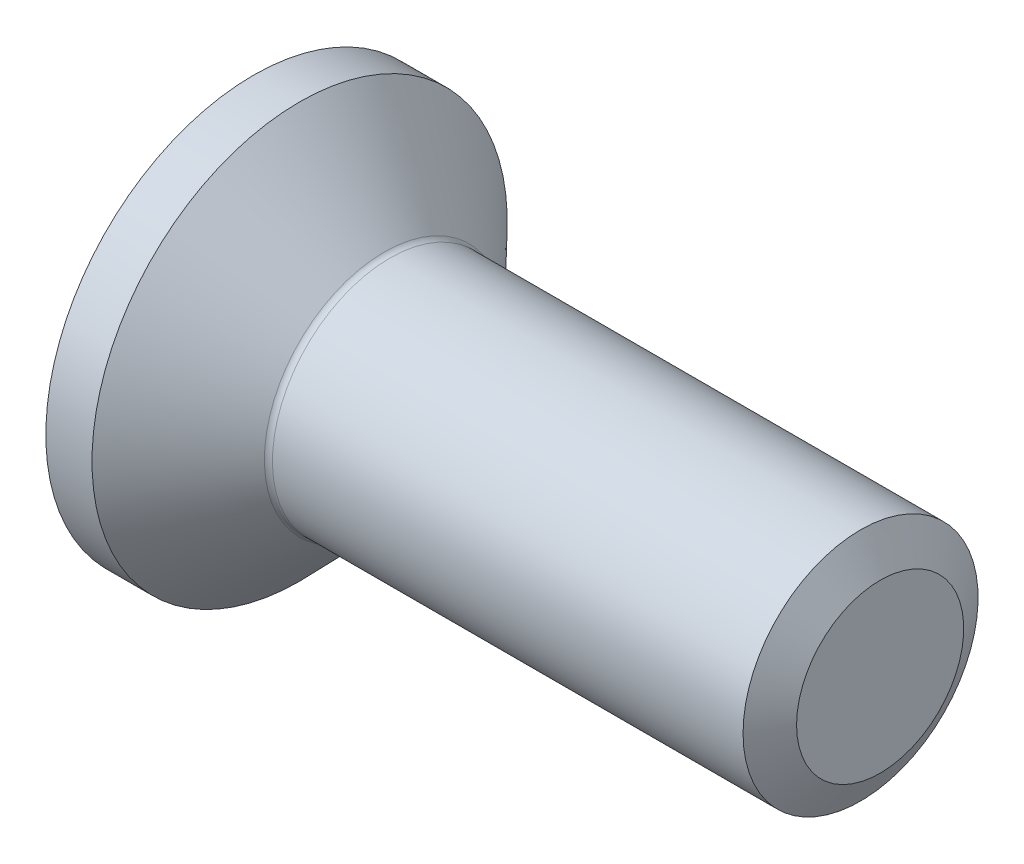
ISO-10303-21;
HEADER;
FILE_DESCRIPTION(('STEP AP214'),'2;1');
FILE_NAME('part.step','',(''),(''),'','','');
FILE_SCHEMA(('AUTOMOTIVE_DESIGN { 1 0 10303 214 1 1 1 1 }'));
ENDSEC;
DATA;
#1=APPLICATION_CONTEXT('core data for automotive mechanical design processes');
#2=APPLICATION_PROTOCOL_DEFINITION('international standard','automotive_design',2000,#1);
#3=PRODUCT_CONTEXT('',#1,'mechanical');
#4=PRODUCT('Part','Part','',(#3));
#5=PRODUCT_RELATED_PRODUCT_CATEGORY('part','',(#4));
#6=PRODUCT_DEFINITION_FORMATION('','',#4);
#7=PRODUCT_DEFINITION_CONTEXT('part definition',#1,'design');
#8=PRODUCT_DEFINITION('design','',#6,#7);
#9=PRODUCT_DEFINITION_SHAPE('','',#8);
#10=(LENGTH_UNIT() NAMED_UNIT(*) SI_UNIT(.MILLI.,.METRE.));
#11=(NAMED_UNIT(*) PLANE_ANGLE_UNIT() SI_UNIT($,.RADIAN.));
#12=(NAMED_UNIT(*) SI_UNIT($,.STERADIAN.) SOLID_ANGLE_UNIT());
#13=UNCERTAINTY_MEASURE_WITH_UNIT(LENGTH_MEASURE(1.E-05),#10,'distance_accuracy_value','');
#14=(GEOMETRIC_REPRESENTATION_CONTEXT(3) GLOBAL_UNCERTAINTY_ASSIGNED_CONTEXT((#13)) GLOBAL_UNIT_ASSIGNED_CONTEXT((#10,
#11,#12)) REPRESENTATION_CONTEXT('',''));
#15=CARTESIAN_POINT('',(0.,0.,0.));
#16=DIRECTION('',(0.,0.,1.));
#17=DIRECTION('',(1.,0.,0.));
#18=AXIS2_PLACEMENT_3D('',#15,#16,#17);
#19=CARTESIAN_POINT('',(0.,0.,0.));
#20=DIRECTION('',(1.,0.,0.));
#21=DIRECTION('',(0.,1.,0.));
#22=AXIS2_PLACEMENT_3D('',#19,#20,#21);
#23=CYLINDRICAL_SURFACE('',#22,1.5);
#24=CARTESIAN_POINT('',(-6.25755251837904,0.,0.));
#25=DIRECTION('',(1.,0.,0.));
#26=DIRECTION('',(0.,1.,0.));
#27=AXIS2_PLACEMENT_3D('',#24,#25,#26);
#28=CIRCLE('',#27,1.5);
#29=CARTESIAN_POINT('',(-6.25755251837904,1.5,0.));
#30=VERTEX_POINT('',#29);
#31=EDGE_CURVE('E131',#30,#30,#28,.T.);
#32=ORIENTED_EDGE('',*,*,#31,.T.);
#33=EDGE_LOOP('',(#32));
#34=FACE_BOUND('',#33,.T.);
#35=CARTESIAN_POINT('',(-0.25,0.,0.));
#36=DIRECTION('',(-1.,0.,0.));
#37=DIRECTION('',(0.,0.,1.));
#38=AXIS2_PLACEMENT_3D('',#35,#36,#37);
#39=CIRCLE('',#38,1.5);
#40=CARTESIAN_POINT('',(-0.25,0.,1.5));
#41=VERTEX_POINT('',#40);
#42=EDGE_CURVE('E319',#41,#41,#39,.T.);
#43=ORIENTED_EDGE('',*,*,#42,.T.);
#44=EDGE_LOOP('',(#43));
#45=FACE_BOUND('',#44,.T.);
#46=ADVANCED_FACE('F44',(#34,#45),#23,.T.);
#47=CARTESIAN_POINT('',(-8.,2.65,0.));
#48=DIRECTION('',(-1.,0.,0.));
#49=DIRECTION('',(0.,-1.,0.));
#50=AXIS2_PLACEMENT_3D('',#47,#48,#49);
#51=PLANE('',#50);
#52=CARTESIAN_POINT('',(-8.,0.,0.));
#53=DIRECTION('',(1.,0.,0.));
#54=DIRECTION('',(0.,1.,0.));
#55=AXIS2_PLACEMENT_3D('',#52,#53,#54);
#56=CIRCLE('',#55,2.65);
#57=CARTESIAN_POINT('',(-8.,2.65,0.));
#58=VERTEX_POINT('',#57);
#59=EDGE_CURVE('E222',#58,#58,#56,.T.);
#60=ORIENTED_EDGE('',*,*,#59,.F.);
#61=EDGE_LOOP('',(#60));
#62=FACE_BOUND('',#61,.T.);
#63=CARTESIAN_POINT('',(-8.,0.,0.));
#64=DIRECTION('',(-1.,0.,0.));
#65=DIRECTION('',(0.,-1.,0.));
#66=AXIS2_PLACEMENT_3D('',#63,#64,#65);
#67=CIRCLE('',#66,1.15470053837925);
#68=CARTESIAN_POINT('',(-8.,-0.577350269189627,1.));
#69=VERTEX_POINT('',#68);
#70=CARTESIAN_POINT('',(-8.,-1.15470053837925,0.));
#71=VERTEX_POINT('',#70);
#72=EDGE_CURVE('E48',#69,#71,#67,.F.);
#73=ORIENTED_EDGE('',*,*,#72,.T.);
#74=CARTESIAN_POINT('',(-8.,-0.577350269189627,-1.));
#75=VERTEX_POINT('',#74);
#76=EDGE_CURVE('E11',#71,#75,#67,.F.);
#77=ORIENTED_EDGE('',*,*,#76,.T.);
#78=CARTESIAN_POINT('',(-8.,0.577350269189627,-0.999999999999999));
#79=VERTEX_POINT('',#78);
#80=EDGE_CURVE('E53',#75,#79,#67,.F.);
#81=ORIENTED_EDGE('',*,*,#80,.T.);
#82=CARTESIAN_POINT('',(-8.,1.15470053837925,0.));
#83=VERTEX_POINT('',#82);
#84=EDGE_CURVE('E118',#79,#83,#67,.F.);
#85=ORIENTED_EDGE('',*,*,#84,.T.);
#86=CARTESIAN_POINT('',(-8.,0.,0.));
#87=DIRECTION('',(-1.,0.,0.));
#88=DIRECTION('',(0.,0.,1.));
#89=AXIS2_PLACEMENT_3D('',#86,#87,#88);
#90=CIRCLE('',#89,1.15470053837925);
#91=CARTESIAN_POINT('',(-8.,0.577350269189629,0.999999999999999));
#92=VERTEX_POINT('',#91);
#93=EDGE_CURVE('E103',#92,#83,#90,.T.);
#94=ORIENTED_EDGE('',*,*,#93,.F.);
#95=EDGE_CURVE('E112',#92,#69,#67,.F.);
#96=ORIENTED_EDGE('',*,*,#95,.T.);
#97=EDGE_LOOP('',(#73,#77,#81,#85,#94,#96));
#98=FACE_BOUND('',#97,.T.);
#99=ADVANCED_FACE('F119',(#62,#98),#51,.T.);
#100=CARTESIAN_POINT('',(0.,0.,0.));
#101=DIRECTION('',(1.,0.,0.));
#102=DIRECTION('',(0.,1.,0.));
#103=AXIS2_PLACEMENT_3D('',#100,#101,#102);
#104=CYLINDRICAL_SURFACE('',#103,2.65);
#105=ORIENTED_EDGE('',*,*,#59,.T.);
#106=EDGE_LOOP('',(#105));
#107=FACE_BOUND('',#106,.T.);
#108=CARTESIAN_POINT('',(-7.41054209102813,0.,0.));
#109=DIRECTION('',(1.,0.,0.));
#110=DIRECTION('',(0.,1.,0.));
#111=AXIS2_PLACEMENT_3D('',#108,#109,#110);
#112=CIRCLE('',#111,2.65);
#113=CARTESIAN_POINT('',(-7.41054209102813,2.65,0.));
#114=VERTEX_POINT('',#113);
#115=EDGE_CURVE('E224',#114,#114,#112,.T.);
#116=ORIENTED_EDGE('',*,*,#115,.F.);
#117=EDGE_LOOP('',(#116));
#118=FACE_BOUND('',#117,.T.);
#119=ADVANCED_FACE('F210',(#107,#118),#104,.T.);
#120=CARTESIAN_POINT('',(-6.3294864984129,0.,0.));
#121=DIRECTION('',(-1.,0.,0.));
#122=DIRECTION('',(0.,-1.,0.));
#123=AXIS2_PLACEMENT_3D('',#120,#121,#122);
#124=CONICAL_SURFACE('',#123,1.5305341629541,0.802851455917393);
#125=ORIENTED_EDGE('',*,*,#115,.T.);
#126=EDGE_LOOP('',(#125));
#127=FACE_BOUND('',#126,.T.);
#128=CARTESIAN_POINT('',(-6.3294864984129,0.,0.));
#129=DIRECTION('',(1.,0.,0.));
#130=DIRECTION('',(0.,1.,0.));
#131=AXIS2_PLACEMENT_3D('',#128,#129,#130);
#132=CIRCLE('',#131,1.5305341629541);
#133=CARTESIAN_POINT('',(-6.3294864984129,1.5305341629541,0.));
#134=VERTEX_POINT('',#133);
#135=EDGE_CURVE('E228',#134,#134,#132,.T.);
#136=ORIENTED_EDGE('',*,*,#135,.F.);
#137=EDGE_LOOP('',(#136));
#138=FACE_BOUND('',#137,.T.);
#139=ADVANCED_FACE('F206',(#127,#138),#124,.T.);
#140=CARTESIAN_POINT('',(-6.25755251837904,0.,0.));
#141=DIRECTION('',(1.,0.,0.));
#142=DIRECTION('',(0.,1.,0.));
#143=AXIS2_PLACEMENT_3D('',#140,#141,#142);
#144=TOROIDAL_SURFACE('',#143,1.6,0.100000000000001);
#145=ORIENTED_EDGE('',*,*,#135,.T.);
#146=EDGE_LOOP('',(#145));
#147=FACE_BOUND('',#146,.T.);
#148=ORIENTED_EDGE('',*,*,#31,.F.);
#149=EDGE_LOOP('',(#148));
#150=FACE_BOUND('',#149,.T.);
#151=ADVANCED_FACE('F202',(#147,#150),#144,.F.);
#152=CARTESIAN_POINT('',(-7.7,0.,0.));
#153=DIRECTION('',(-1.,0.,0.));
#154=DIRECTION('',(0.,0.,1.));
#155=AXIS2_PLACEMENT_3D('',#152,#153,#154);
#156=CONICAL_SURFACE('',#155,0.,1.31660847419538);
#157=CARTESIAN_POINT('',(-8.00003000449955,-0.577234799135788,1.0002));
#158=CARTESIAN_POINT('',(-7.99379291920422,-0.601225021738599,0.958647715567044));
#159=CARTESIAN_POINT('',(-7.98813137861672,-0.625256195021441,0.917024502475671));
#160=CARTESIAN_POINT('',(-7.97818542172232,-0.673398386330439,0.833639781140784));
#161=CARTESIAN_POINT('',(-7.9739015302713,-0.697509431260084,0.791878226299064));
#162=CARTESIAN_POINT('',(-7.96695890316674,-0.745673772514855,0.708455140132714));
#163=CARTESIAN_POINT('',(-7.9642923745456,-0.769726780462717,0.66679410829216));
#164=CARTESIAN_POINT('',(-7.96071689299408,-0.817861664223349,0.583422044002323));
#165=CARTESIAN_POINT('',(-7.95980762113533,-0.841943534003894,0.541711022001162));
#166=CARTESIAN_POINT('',(-7.95980762113533,-0.890107273564984,0.458288977998839));
#167=CARTESIAN_POINT('',(-7.96071689299408,-0.914189143345529,0.416577955997678));
#168=CARTESIAN_POINT('',(-7.9642923745456,-0.962324027106161,0.333205891707841));
#169=CARTESIAN_POINT('',(-7.96695890316674,-0.986377035054023,0.291544859867286));
#170=CARTESIAN_POINT('',(-7.9739015302713,-1.03454137630879,0.208121773700937));
#171=CARTESIAN_POINT('',(-7.97818542172232,-1.05865242123844,0.166360218859216));
#172=CARTESIAN_POINT('',(-7.98813137861672,-1.10679461254744,0.0829754975243295));
#173=CARTESIAN_POINT('',(-7.99379291920422,-1.13082578583028,0.0413522844329567));
#174=CARTESIAN_POINT('',(-8.00003000449955,-1.15481600843309,-0.000199999999999328));
#175=B_SPLINE_CURVE_WITH_KNOTS('',3,(#157,#158,#159,#160,#161,#162,#163,#164,#165,#166,#167,
#168,#169,#170,#171,#172,#173,#174),.UNSPECIFIED.,.F.,.F.,(4,2,2,2,2,2,2,2,4),(0.,
0.145159524820137,0.290374287087485,0.434883682122849,0.57936684736763,0.723850012612411,
0.868359407647776,1.01357416991512,1.15873369473526),.UNSPECIFIED.);
#176=EDGE_CURVE('E137',#69,#71,#175,.T.);
#177=ORIENTED_EDGE('',*,*,#176,.T.);
#178=ORIENTED_EDGE('',*,*,#72,.F.);
#179=EDGE_LOOP('',(#177,#178));
#180=FACE_BOUND('',#179,.T.);
#181=ADVANCED_FACE('F205',(#180),#156,.F.);
#182=CARTESIAN_POINT('',(-8.17013380617566,-1.50813004503231,1.));
#183=CARTESIAN_POINT('',(-8.16035504345823,-1.46296169551439,1.));
#184=CARTESIAN_POINT('',(-8.15070106343194,-1.41776633015547,1.));
#185=CARTESIAN_POINT('',(-8.13170572494957,-1.32730802004726,1.));
#186=CARTESIAN_POINT('',(-8.12236437980433,-1.28204507250605,1.));
#187=CARTESIAN_POINT('',(-8.094887707109,-1.1460540932135,1.));
#188=CARTESIAN_POINT('',(-8.07731859348705,-1.05520983554783,1.));
#189=CARTESIAN_POINT('',(-8.04461131203549,-0.873838301527071,1.));
#190=CARTESIAN_POINT('',(-8.02945456691833,-0.783314439111171,1.));
#191=CARTESIAN_POINT('',(-8.00260008692164,-0.60175454493786,1.));
#192=CARTESIAN_POINT('',(-7.99090169604683,-0.510718613654572,1.));
#193=CARTESIAN_POINT('',(-7.97246881045878,-0.32714728936339,1.));
#194=CARTESIAN_POINT('',(-7.96578776188203,-0.234606191530869,1.));
#195=CARTESIAN_POINT('',(-7.95903683627918,-0.0493046546038927,1.));
#196=CARTESIAN_POINT('',(-7.9589640024594,0.0434556678202323,1.));
#197=CARTESIAN_POINT('',(-7.96545349339635,0.229083736297406,1.));
#198=CARTESIAN_POINT('',(-7.97204147369278,0.32195051098941,1.));
#199=CARTESIAN_POINT('',(-7.99045721398657,0.50719254766132,1.));
#200=CARTESIAN_POINT('',(-8.00228848161145,0.599567438647765,1.));
#201=CARTESIAN_POINT('',(-8.02981183130456,0.785811374344474,1.));
#202=CARTESIAN_POINT('',(-8.04558360306669,0.879668210998825,1.));
#203=CARTESIAN_POINT('',(-8.07952329667281,1.06695285350417,1.));
#204=CARTESIAN_POINT('',(-8.09769157871932,1.16038059267178,1.));
#205=CARTESIAN_POINT('',(-8.13558531630106,1.34694314919725,1.));
#206=CARTESIAN_POINT('',(-8.15531120297018,1.44007787798179,1.));
#207=CARTESIAN_POINT('',(-8.19579713229142,1.62612272763755,1.));
#208=CARTESIAN_POINT('',(-8.21655719605602,1.71903284388273,1.));
#209=CARTESIAN_POINT('',(-8.25854857426009,1.90363742744431,1.));
#210=CARTESIAN_POINT('',(-8.27977186890882,1.99533372655925,1.));
#211=CARTESIAN_POINT('',(-8.32271430579133,2.17861191601367,1.));
#212=CARTESIAN_POINT('',(-8.34443345858081,2.27019380387373,1.));
#213=CARTESIAN_POINT('',(-8.38820424202331,2.45314970796374,1.));
#214=CARTESIAN_POINT('',(-8.41025539433742,2.54452383886909,1.));
#215=CARTESIAN_POINT('',(-8.45463324718544,2.72720190599484,1.));
#216=CARTESIAN_POINT('',(-8.47695993829108,2.81850584450411,1.));
#217=CARTESIAN_POINT('',(-8.49938266952113,2.9097859214388,1.));
#218=B_SPLINE_CURVE_WITH_KNOTS('',3,(#182,#183,#184,#185,#186,#187,#188,#189,#190,#191,#192,
#193,#194,#195,#196,#197,#198,#199,#200,#201,#202,#203,#204,#205,#206,#207,#208,#209,#210,#211,
#212,#213,#214,#215,#216,#217),.UNSPECIFIED.,.F.,.F.,(4,2,2,2,2,2,2,2,2,2,2,2,2,2,2,2,2,4),(0.,
0.138643869889783,0.277293635233153,0.554857004517545,0.830167022781708,1.10542478551795,
1.38357462934898,1.66160001660696,1.94070037269332,2.2199877224158,2.50545939030146,
2.7909740144124,3.07656794584653,3.36216771000262,3.64452690710853,3.92689212062335,
4.20888343548739,4.49086512790398),.UNSPECIFIED.);
#219=EDGE_CURVE('E108',#92,#69,#218,.F.);
#220=ORIENTED_EDGE('',*,*,#219,.T.);
#221=ORIENTED_EDGE('',*,*,#95,.F.);
#222=EDGE_LOOP('',(#220,#221));
#223=FACE_BOUND('',#222,.T.);
#224=ADVANCED_FACE('F113',(#223),#156,.F.);
#225=CARTESIAN_POINT('',(-8.00003000449955,1.15481600843309,-0.000199999999999895));
#226=CARTESIAN_POINT('',(-7.99379291920422,1.13082578583028,0.0413522844329562));
#227=CARTESIAN_POINT('',(-7.98813137861672,1.10679461254744,0.0829754975243289));
#228=CARTESIAN_POINT('',(-7.97818542172232,1.05865242123844,0.166360218859216));
#229=CARTESIAN_POINT('',(-7.9739015302713,1.03454137630879,0.208121773700936));
#230=CARTESIAN_POINT('',(-7.96695890316674,0.986377035054023,0.291544859867286));
#231=CARTESIAN_POINT('',(-7.9642923745456,0.962324027106161,0.333205891707841));
#232=CARTESIAN_POINT('',(-7.96071689299408,0.914189143345529,0.416577955997677));
#233=CARTESIAN_POINT('',(-7.95980762113533,0.890107273564985,0.458288977998839));
#234=CARTESIAN_POINT('',(-7.95980762113533,0.841943534003895,0.541711022001162));
#235=CARTESIAN_POINT('',(-7.96071689299408,0.81786166422335,0.583422044002323));
#236=CARTESIAN_POINT('',(-7.9642923745456,0.769726780462718,0.666794108292159));
#237=CARTESIAN_POINT('',(-7.96695890316674,0.745673772514856,0.708455140132714));
#238=CARTESIAN_POINT('',(-7.9739015302713,0.697509431260085,0.791878226299064));
#239=CARTESIAN_POINT('',(-7.97818542172232,0.67339838633044,0.833639781140785));
#240=CARTESIAN_POINT('',(-7.98813137861672,0.625256195021441,0.917024502475671));
#241=CARTESIAN_POINT('',(-7.99379291920422,0.6012250217386,0.958647715567044));
#242=CARTESIAN_POINT('',(-8.00003000449955,0.577234799135789,1.0002));
#243=B_SPLINE_CURVE_WITH_KNOTS('',3,(#225,#226,#227,#228,#229,#230,#231,#232,#233,#234,#235,
#236,#237,#238,#239,#240,#241,#242),.UNSPECIFIED.,.F.,.F.,(4,2,2,2,2,2,2,2,4),(0.,
0.145159524820137,0.290374287087485,0.434883682122849,0.57936684736763,0.723850012612412,
0.868359407647776,1.01357416991512,1.15873369473526),.UNSPECIFIED.);
#244=EDGE_CURVE('E99',#83,#92,#243,.T.);
#245=ORIENTED_EDGE('',*,*,#244,.T.);
#246=ORIENTED_EDGE('',*,*,#93,.T.);
#247=EDGE_LOOP('',(#245,#246));
#248=FACE_BOUND('',#247,.T.);
#249=ADVANCED_FACE('F101',(#248),#156,.F.);
#250=CARTESIAN_POINT('',(-8.00003000449955,0.577234799135789,-1.0002));
#251=CARTESIAN_POINT('',(-7.99379291920422,0.6012250217386,-0.958647715567043));
#252=CARTESIAN_POINT('',(-7.98813137861672,0.625256195021441,-0.91702450247567));
#253=CARTESIAN_POINT('',(-7.97818542172232,0.67339838633044,-0.833639781140783));
#254=CARTESIAN_POINT('',(-7.9739015302713,0.697509431260085,-0.791878226299063));
#255=CARTESIAN_POINT('',(-7.96695890316674,0.745673772514856,-0.708455140132713));
#256=CARTESIAN_POINT('',(-7.9642923745456,0.769726780462718,-0.666794108292159));
#257=CARTESIAN_POINT('',(-7.96071689299408,0.81786166422335,-0.583422044002322));
#258=CARTESIAN_POINT('',(-7.95980762113533,0.841943534003895,-0.541711022001161));
#259=CARTESIAN_POINT('',(-7.95980762113533,0.890107273564985,-0.458288977998838));
#260=CARTESIAN_POINT('',(-7.96071689299408,0.914189143345529,-0.416577955997677));
#261=CARTESIAN_POINT('',(-7.9642923745456,0.962324027106161,-0.33320589170784));
#262=CARTESIAN_POINT('',(-7.96695890316674,0.986377035054023,-0.291544859867286));
#263=CARTESIAN_POINT('',(-7.9739015302713,1.03454137630879,-0.208121773700936));
#264=CARTESIAN_POINT('',(-7.97818542172232,1.05865242123844,-0.166360218859216));
#265=CARTESIAN_POINT('',(-7.98813137861672,1.10679461254744,-0.0829754975243288));
#266=CARTESIAN_POINT('',(-7.99379291920422,1.13082578583028,-0.041352284432956));
#267=CARTESIAN_POINT('',(-8.00003000449955,1.15481600843309,0.000199999999999821));
#268=B_SPLINE_CURVE_WITH_KNOTS('',3,(#250,#251,#252,#253,#254,#255,#256,#257,#258,#259,#260,
#261,#262,#263,#264,#265,#266,#267),.UNSPECIFIED.,.F.,.F.,(4,2,2,2,2,2,2,2,4),(0.,
0.145159524820137,0.290374287087485,0.434883682122849,0.57936684736763,0.723850012612411,
0.868359407647776,1.01357416991512,1.15873369473526),.UNSPECIFIED.);
#269=EDGE_CURVE('E121',#79,#83,#268,.T.);
#270=ORIENTED_EDGE('',*,*,#269,.T.);
#271=ORIENTED_EDGE('',*,*,#84,.F.);
#272=EDGE_LOOP('',(#270,#271));
#273=FACE_BOUND('',#272,.T.);
#274=ADVANCED_FACE('F302',(#273),#156,.F.);
#275=CARTESIAN_POINT('',(-8.17013380617566,-1.50813004503231,-0.999999999999999));
#276=CARTESIAN_POINT('',(-8.16035504345823,-1.46296169551439,-0.999999999999999));
#277=CARTESIAN_POINT('',(-8.15070106343194,-1.41776633015547,-0.999999999999999));
#278=CARTESIAN_POINT('',(-8.13170572494957,-1.32730802004726,-0.999999999999999));
#279=CARTESIAN_POINT('',(-8.12236437980433,-1.28204507250605,-0.999999999999999));
#280=CARTESIAN_POINT('',(-8.094887707109,-1.1460540932135,-0.999999999999999));
#281=CARTESIAN_POINT('',(-8.07731859348705,-1.05520983554783,-0.999999999999999));
#282=CARTESIAN_POINT('',(-8.04461131203549,-0.873838301527072,-0.999999999999999));
#283=CARTESIAN_POINT('',(-8.02945456691833,-0.783314439111172,-0.999999999999999));
#284=CARTESIAN_POINT('',(-8.00260008692164,-0.60175454493786,-0.999999999999999));
#285=CARTESIAN_POINT('',(-7.99090169604683,-0.510718613654572,-0.999999999999999));
#286=CARTESIAN_POINT('',(-7.97246881045878,-0.32714728936339,-0.999999999999999));
#287=CARTESIAN_POINT('',(-7.96578776188203,-0.234606191530869,-0.999999999999999));
#288=CARTESIAN_POINT('',(-7.95903683627918,-0.0493046546038927,-0.999999999999999));
#289=CARTESIAN_POINT('',(-7.9589640024594,0.0434556678202323,-0.999999999999999));
#290=CARTESIAN_POINT('',(-7.96545349339635,0.229083736297406,-0.999999999999999));
#291=CARTESIAN_POINT('',(-7.97204147369278,0.32195051098941,-0.999999999999999));
#292=CARTESIAN_POINT('',(-7.99045721398657,0.50719254766132,-0.999999999999999));
#293=CARTESIAN_POINT('',(-8.00228848161145,0.599567438647765,-0.999999999999999));
#294=CARTESIAN_POINT('',(-8.02981183130456,0.785811374344474,-0.999999999999999));
#295=CARTESIAN_POINT('',(-8.04558360306669,0.879668210998825,-0.999999999999999));
#296=CARTESIAN_POINT('',(-8.07952329667281,1.06695285350417,-0.999999999999999));
#297=CARTESIAN_POINT('',(-8.09769157871932,1.16038059267178,-0.999999999999999));
#298=CARTESIAN_POINT('',(-8.13558531630106,1.34694314919725,-0.999999999999999));
#299=CARTESIAN_POINT('',(-8.15531120297018,1.44007787798179,-0.999999999999999));
#300=CARTESIAN_POINT('',(-8.19579713229142,1.62612272763755,-0.999999999999999));
#301=CARTESIAN_POINT('',(-8.21655719605602,1.71903284388273,-0.999999999999999));
#302=CARTESIAN_POINT('',(-8.25854857426009,1.90363742744431,-0.999999999999999));
#303=CARTESIAN_POINT('',(-8.27977186890882,1.99533372655925,-0.999999999999999));
#304=CARTESIAN_POINT('',(-8.32271430579133,2.17861191601367,-0.999999999999999));
#305=CARTESIAN_POINT('',(-8.34443345858081,2.27019380387373,-0.999999999999999));
#306=CARTESIAN_POINT('',(-8.38820424202331,2.45314970796374,-0.999999999999999));
#307=CARTESIAN_POINT('',(-8.41025539433742,2.54452383886909,-0.999999999999999));
#308=CARTESIAN_POINT('',(-8.45463324718544,2.72720190599484,-0.999999999999999));
#309=CARTESIAN_POINT('',(-8.47695993829108,2.81850584450411,-0.999999999999999));
#310=CARTESIAN_POINT('',(-8.49938266952113,2.9097859214388,-0.999999999999999));
#311=B_SPLINE_CURVE_WITH_KNOTS('',3,(#275,#276,#277,#278,#279,#280,#281,#282,#283,#284,#285,
#286,#287,#288,#289,#290,#291,#292,#293,#294,#295,#296,#297,#298,#299,#300,#301,#302,#303,#304,
#305,#306,#307,#308,#309,#310),.UNSPECIFIED.,.F.,.F.,(4,2,2,2,2,2,2,2,2,2,2,2,2,2,2,2,2,4),(0.,
0.138643869889783,0.277293635233153,0.554857004517545,0.830167022781708,1.10542478551795,
1.38357462934898,1.66160001660696,1.94070037269332,2.2199877224158,2.50545939030146,
2.7909740144124,3.07656794584653,3.36216771000262,3.64452690710853,3.92689212062335,
4.20888343548739,4.49086512790398),.UNSPECIFIED.);
#312=EDGE_CURVE('E258',#75,#79,#311,.T.);
#313=ORIENTED_EDGE('',*,*,#312,.T.);
#314=ORIENTED_EDGE('',*,*,#80,.F.);
#315=EDGE_LOOP('',(#313,#314));
#316=FACE_BOUND('',#315,.T.);
#317=ADVANCED_FACE('F290',(#316),#156,.F.);
#318=CARTESIAN_POINT('',(-8.00003000449955,-1.15481600843309,0.000200000000000662));
#319=CARTESIAN_POINT('',(-7.99379291920422,-1.13082578583028,-0.0413522844329553));
#320=CARTESIAN_POINT('',(-7.98813137861672,-1.10679461254744,-0.0829754975243281));
#321=CARTESIAN_POINT('',(-7.97818542172232,-1.05865242123844,-0.166360218859215));
#322=CARTESIAN_POINT('',(-7.9739015302713,-1.03454137630879,-0.208121773700935));
#323=CARTESIAN_POINT('',(-7.96695890316674,-0.986377035054023,-0.291544859867285));
#324=CARTESIAN_POINT('',(-7.9642923745456,-0.962324027106161,-0.33320589170784));
#325=CARTESIAN_POINT('',(-7.96071689299408,-0.914189143345529,-0.416577955997676));
#326=CARTESIAN_POINT('',(-7.95980762113533,-0.890107273564984,-0.458288977998838));
#327=CARTESIAN_POINT('',(-7.95980762113533,-0.841943534003894,-0.541711022001161));
#328=CARTESIAN_POINT('',(-7.96071689299408,-0.817861664223349,-0.583422044002322));
#329=CARTESIAN_POINT('',(-7.9642923745456,-0.769726780462718,-0.666794108292158));
#330=CARTESIAN_POINT('',(-7.96695890316674,-0.745673772514856,-0.708455140132713));
#331=CARTESIAN_POINT('',(-7.9739015302713,-0.697509431260084,-0.791878226299063));
#332=CARTESIAN_POINT('',(-7.97818542172232,-0.67339838633044,-0.833639781140784));
#333=CARTESIAN_POINT('',(-7.98813137861672,-0.625256195021441,-0.91702450247567));
#334=CARTESIAN_POINT('',(-7.99379291920422,-0.6012250217386,-0.958647715567043));
#335=CARTESIAN_POINT('',(-8.00003000449955,-0.577234799135789,-1.0002));
#336=B_SPLINE_CURVE_WITH_KNOTS('',3,(#318,#319,#320,#321,#322,#323,#324,#325,#326,#327,#328,
#329,#330,#331,#332,#333,#334,#335),.UNSPECIFIED.,.F.,.F.,(4,2,2,2,2,2,2,2,4),(0.,
0.145159524820137,0.290374287087485,0.434883682122849,0.57936684736763,0.723850012612411,
0.868359407647776,1.01357416991512,1.15873369473526),.UNSPECIFIED.);
#337=EDGE_CURVE('E139',#71,#75,#336,.T.);
#338=ORIENTED_EDGE('',*,*,#337,.T.);
#339=ORIENTED_EDGE('',*,*,#76,.F.);
#340=EDGE_LOOP('',(#338,#339));
#341=FACE_BOUND('',#340,.T.);
#342=ADVANCED_FACE('F292',(#341),#156,.F.);
#343=CARTESIAN_POINT('',(-6.9,0.,0.));
#344=DIRECTION('',(-1.,0.,0.));
#345=DIRECTION('',(0.,0.,1.));
#346=AXIS2_PLACEMENT_3D('',#343,#344,#345);
#347=CONICAL_SURFACE('',#346,1.15470053837925,1.0471975511966);
#348=CARTESIAN_POINT('',(-6.23333333333334,0.,0.));
#349=VERTEX_POINT('',#348);
#350=VERTEX_LOOP('',#349);
#351=FACE_BOUND('',#350,.T.);
#352=CARTESIAN_POINT('',(-7.27183528873947,-1.49514512143374,1.));
#353=CARTESIAN_POINT('',(-7.25111502079343,-1.4519612611533,1.));
#354=CARTESIAN_POINT('',(-7.23061367234946,-1.40867282404236,1.));
#355=CARTESIAN_POINT('',(-7.1901634335246,-1.32182947914248,1.));
#356=CARTESIAN_POINT('',(-7.17021464256729,-1.27827452509756,1.));
#357=CARTESIAN_POINT('',(-7.11114515483648,-1.14662339890625,1.));
#358=CARTESIAN_POINT('',(-7.07305252653304,-1.05805724149108,1.));
#359=CARTESIAN_POINT('',(-7.00024582070057,-0.876833003172496,1.));
#360=CARTESIAN_POINT('',(-6.96564584045392,-0.784128452056495,1.));
#361=CARTESIAN_POINT('',(-6.90407347381845,-0.59633174653213,1.));
#362=CARTESIAN_POINT('',(-6.87708128484785,-0.501246505541256,1.));
#363=CARTESIAN_POINT('',(-6.84577577003502,-0.356699986452702,1.));
#364=CARTESIAN_POINT('',(-6.83687509854699,-0.308244163171708,1.));
#365=CARTESIAN_POINT('',(-6.82274243175691,-0.210788870695442,1.));
#366=CARTESIAN_POINT('',(-6.81751018853518,-0.161789438465741,1.));
#367=CARTESIAN_POINT('',(-6.81119898098177,-0.0641060489970654,1.));
#368=CARTESIAN_POINT('',(-6.8100710050111,-0.0154253461269764,1.));
#369=CARTESIAN_POINT('',(-6.81193297830514,0.0818553564032759,1.));
#370=CARTESIAN_POINT('',(-6.81492318255361,0.130455350879703,1.));
#371=CARTESIAN_POINT('',(-6.8271183217293,0.250369589613779,1.));
#372=CARTESIAN_POINT('',(-6.83860856098489,0.321451919115028,1.));
#373=CARTESIAN_POINT('',(-6.86824031739763,0.462229038490169,1.));
#374=CARTESIAN_POINT('',(-6.88638985094493,0.531922048861734,1.));
#375=CARTESIAN_POINT('',(-6.92786972268665,0.671415729806807,1.));
#376=CARTESIAN_POINT('',(-6.95130716830693,0.741183729418072,1.));
#377=CARTESIAN_POINT('',(-7.00156448824641,0.87943831939629,1.));
#378=CARTESIAN_POINT('',(-7.02838317523047,0.947925349932562,1.));
#379=CARTESIAN_POINT('',(-7.1000539154734,1.12214515906645,1.));
#380=CARTESIAN_POINT('',(-7.14657230519898,1.22718574040678,1.));
#381=CARTESIAN_POINT('',(-7.24287692224798,1.43575968104558,1.));
#382=CARTESIAN_POINT('',(-7.29266398782224,1.53929264533348,1.));
#383=CARTESIAN_POINT('',(-7.39433644453464,1.74546702338822,1.));
#384=CARTESIAN_POINT('',(-7.44622418186697,1.84810727553999,1.));
#385=CARTESIAN_POINT('',(-7.55133836883522,2.05270058021726,1.));
#386=CARTESIAN_POINT('',(-7.60456486267233,2.15465360991173,1.));
#387=CARTESIAN_POINT('',(-7.7068669169112,2.34846553091283,1.));
#388=CARTESIAN_POINT('',(-7.75585965896403,2.44036823161571,1.));
#389=CARTESIAN_POINT('',(-7.85440313282821,2.62387799005301,1.));
#390=CARTESIAN_POINT('',(-7.90395388528948,2.71548503668387,1.));
#391=CARTESIAN_POINT('',(-8.00334710767982,2.89823865557593,1.));
#392=CARTESIAN_POINT('',(-8.05318851504101,2.98938580641155,1.));
#393=CARTESIAN_POINT('',(-8.15319572337612,3.17149583112622,1.));
#394=CARTESIAN_POINT('',(-8.20336150723714,3.26245871439935,1.));
#395=CARTESIAN_POINT('',(-8.25364621220496,3.35335539208176,1.));
#396=B_SPLINE_CURVE_WITH_KNOTS('',3,(#352,#353,#354,#355,#356,#357,#358,#359,#360,#361,#362,
#363,#364,#365,#366,#367,#368,#369,#370,#371,#372,#373,#374,#375,#376,#377,#378,#379,#380,#381,
#382,#383,#384,#385,#386,#387,#388,#389,#390,#391,#392,#393,#394,#395),.UNSPECIFIED.,.F.,.F.,(4,
2,2,2,2,2,2,2,2,2,2,2,2,2,2,2,2,2,2,2,2,4),(0.,0.14369034182065,0.287406372566272,
0.576560332877491,0.87325948893403,1.16917907000006,1.31686338831957,1.46453772487642,
1.61044269221659,1.75635669390451,1.97192533331898,2.18775432802313,2.40842600301165,
2.62902040304935,2.97355048126458,3.31816926186283,3.66318417395131,4.00821049225242,
4.32064609598597,4.63309330006988,4.94474578248761,5.25638195528641),.UNSPECIFIED.);
#397=CARTESIAN_POINT('',(-6.9,-0.577350269189626,1.));
#398=VERTEX_POINT('',#397);
#399=CARTESIAN_POINT('',(-6.9,0.577350269189627,1.));
#400=VERTEX_POINT('',#399);
#401=EDGE_CURVE('E171',#398,#400,#396,.T.);
#402=ORIENTED_EDGE('',*,*,#401,.T.);
#403=CARTESIAN_POINT('',(-6.90006667666567,0.577234799135789,1.0002));
#404=CARTESIAN_POINT('',(-6.88540897364915,0.602607795820549,0.95625268060172));
#405=CARTESIAN_POINT('',(-6.8720777236209,0.628199807531659,0.91192601605018));
#406=CARTESIAN_POINT('',(-6.84880650762345,0.679827098330832,0.822504925328878));
#407=CARTESIAN_POINT('',(-6.83887477654978,0.705863295614159,0.777408908798269));
#408=CARTESIAN_POINT('',(-6.82341269488208,0.757612978088369,0.687775829477381));
#409=CARTESIAN_POINT('',(-6.81777946809895,0.783318495222184,0.64325256776678));
#410=CARTESIAN_POINT('',(-6.81105128864025,0.834850648373672,0.553996260284982));
#411=CARTESIAN_POINT('',(-6.80995076792166,0.860677096749782,0.509263539518505));
#412=CARTESIAN_POINT('',(-6.81222505229814,0.908946264126691,0.425658889182653));
#413=CARTESIAN_POINT('',(-6.81504143886341,0.931396163287558,0.386774523211233));
#414=CARTESIAN_POINT('',(-6.82397245021735,0.976149681982094,0.309259155014813));
#415=CARTESIAN_POINT('',(-6.8300901337543,0.998453146411452,0.27062842143836));
#416=CARTESIAN_POINT('',(-6.84538572572582,1.04329913914046,0.192952883515855));
#417=CARTESIAN_POINT('',(-6.85462855216896,1.0658359836813,0.153917923728832));
#418=CARTESIAN_POINT('',(-6.87560684575553,1.11057330008463,0.0764306187239877));
#419=CARTESIAN_POINT('',(-6.88733737513366,1.13277434629517,0.0379772787061407));
#420=CARTESIAN_POINT('',(-6.90006667666567,1.15481600843309,-0.000199999999999952));
#421=B_SPLINE_CURVE_WITH_KNOTS('',3,(#403,#404,#405,#406,#407,#408,#409,#410,#411,#412,#413,
#414,#415,#416,#417,#418,#419,#420),.UNSPECIFIED.,.F.,.F.,(4,2,2,2,2,2,2,2,4),(0.,
0.158523820030115,0.317428970089342,0.472400167924633,0.627180939971648,0.762016584872711,
0.896977373984233,1.03493410168667,1.17261952416172),.UNSPECIFIED.);
#422=CARTESIAN_POINT('',(-6.9,1.15470053837925,0.));
#423=VERTEX_POINT('',#422);
#424=EDGE_CURVE('E128',#400,#423,#421,.T.);
#425=ORIENTED_EDGE('',*,*,#424,.T.);
#426=CARTESIAN_POINT('',(-6.90006667666567,1.15481600843309,0.000200000000000105));
#427=CARTESIAN_POINT('',(-6.88540897364915,1.12944301174833,-0.0437473193982799));
#428=CARTESIAN_POINT('',(-6.8720777236209,1.10385100003722,-0.0880739839498203));
#429=CARTESIAN_POINT('',(-6.84880650762345,1.05222370923805,-0.177495074671122));
#430=CARTESIAN_POINT('',(-6.83887477654978,1.02618751195472,-0.222591091201731));
#431=CARTESIAN_POINT('',(-6.82341269488208,0.974437829480511,-0.312224170522619));
#432=CARTESIAN_POINT('',(-6.81777946809895,0.948732312346696,-0.356747432233219));
#433=CARTESIAN_POINT('',(-6.81105128864025,0.897200159195207,-0.446003739715018));
#434=CARTESIAN_POINT('',(-6.80995076792166,0.871373710819097,-0.490736460481495));
#435=CARTESIAN_POINT('',(-6.81222505229814,0.823104543442189,-0.574341110817347));
#436=CARTESIAN_POINT('',(-6.81504143886341,0.800654644281321,-0.613225476788767));
#437=CARTESIAN_POINT('',(-6.82397245021735,0.755901125586786,-0.690740844985186));
#438=CARTESIAN_POINT('',(-6.8300901337543,0.733597661157428,-0.729371578561639));
#439=CARTESIAN_POINT('',(-6.84538572572582,0.68875166842842,-0.807047116484145));
#440=CARTESIAN_POINT('',(-6.85462855216896,0.666214823887577,-0.846082076271167));
#441=CARTESIAN_POINT('',(-6.87560684575553,0.621477507484251,-0.923569381276011));
#442=CARTESIAN_POINT('',(-6.88733737513366,0.599276461273707,-0.962022721293858));
#443=CARTESIAN_POINT('',(-6.90006667666567,0.577234799135789,-1.0002));
#444=B_SPLINE_CURVE_WITH_KNOTS('',3,(#426,#427,#428,#429,#430,#431,#432,#433,#434,#435,#436,
#437,#438,#439,#440,#441,#442,#443),.UNSPECIFIED.,.F.,.F.,(4,2,2,2,2,2,2,2,4),(0.,
0.158523820030116,0.317428970089343,0.472400167924634,0.627180939971649,0.762016584872711,
0.896977373984233,1.03493410168667,1.17261952416172),.UNSPECIFIED.);
#445=CARTESIAN_POINT('',(-6.9,0.577350269189627,-1.));
#446=VERTEX_POINT('',#445);
#447=EDGE_CURVE('E223',#423,#446,#444,.T.);
#448=ORIENTED_EDGE('',*,*,#447,.T.);
#449=CARTESIAN_POINT('',(-7.27183528873947,-1.49514512143374,-0.999999999999999));
#450=CARTESIAN_POINT('',(-7.25111502079343,-1.4519612611533,-0.999999999999999));
#451=CARTESIAN_POINT('',(-7.23061367234946,-1.40867282404236,-0.999999999999999));
#452=CARTESIAN_POINT('',(-7.1901634335246,-1.32182947914248,-0.999999999999999));
#453=CARTESIAN_POINT('',(-7.17021464256729,-1.27827452509756,-0.999999999999999));
#454=CARTESIAN_POINT('',(-7.11114515483648,-1.14662339890625,-0.999999999999999));
#455=CARTESIAN_POINT('',(-7.07305252653304,-1.05805724149108,-0.999999999999999));
#456=CARTESIAN_POINT('',(-7.00024582070057,-0.876833003172497,-0.999999999999999));
#457=CARTESIAN_POINT('',(-6.96564584045392,-0.784128452056496,-0.999999999999999));
#458=CARTESIAN_POINT('',(-6.90407347381845,-0.596331746532131,-0.999999999999999));
#459=CARTESIAN_POINT('',(-6.87708128484785,-0.501246505541257,-0.999999999999999));
#460=CARTESIAN_POINT('',(-6.84577577003502,-0.356699986452704,-0.999999999999999));
#461=CARTESIAN_POINT('',(-6.83687509854699,-0.30824416317171,-0.999999999999999));
#462=CARTESIAN_POINT('',(-6.82274243175691,-0.210788870695443,-0.999999999999999));
#463=CARTESIAN_POINT('',(-6.81751018853518,-0.161789438465743,-0.999999999999999));
#464=CARTESIAN_POINT('',(-6.81119898098177,-0.0641060489970665,-0.999999999999999));
#465=CARTESIAN_POINT('',(-6.81007100501111,-0.0154253461269774,-0.999999999999999));
#466=CARTESIAN_POINT('',(-6.81193297830514,0.0818553564032751,-0.999999999999999));
#467=CARTESIAN_POINT('',(-6.81492318255361,0.130455350879702,-0.999999999999999));
#468=CARTESIAN_POINT('',(-6.8271183217293,0.250369589613778,-0.999999999999999));
#469=CARTESIAN_POINT('',(-6.83860856098489,0.321451919115027,-0.999999999999999));
#470=CARTESIAN_POINT('',(-6.86824031739763,0.462229038490167,-0.999999999999999));
#471=CARTESIAN_POINT('',(-6.88638985094493,0.531922048861732,-0.999999999999999));
#472=CARTESIAN_POINT('',(-6.92786972268665,0.671415729806806,-0.999999999999999));
#473=CARTESIAN_POINT('',(-6.95130716830693,0.741183729418071,-0.999999999999999));
#474=CARTESIAN_POINT('',(-7.00156448824641,0.879438319396289,-0.999999999999999));
#475=CARTESIAN_POINT('',(-7.02838317523047,0.947925349932561,-0.999999999999999));
#476=CARTESIAN_POINT('',(-7.10005391547339,1.12214515906645,-0.999999999999999));
#477=CARTESIAN_POINT('',(-7.14657230519898,1.22718574040678,-0.999999999999999));
#478=CARTESIAN_POINT('',(-7.24287692224798,1.43575968104558,-0.999999999999999));
#479=CARTESIAN_POINT('',(-7.29266398782224,1.53929264533348,-0.999999999999999));
#480=CARTESIAN_POINT('',(-7.39433644453464,1.74546702338822,-0.999999999999999));
#481=CARTESIAN_POINT('',(-7.44622418186697,1.84810727553999,-0.999999999999999));
#482=CARTESIAN_POINT('',(-7.55133836883522,2.05270058021726,-0.999999999999999));
#483=CARTESIAN_POINT('',(-7.60456486267233,2.15465360991173,-0.999999999999999));
#484=CARTESIAN_POINT('',(-7.7068669169112,2.34846553091283,-0.999999999999999));
#485=CARTESIAN_POINT('',(-7.75585965896403,2.44036823161571,-0.999999999999999));
#486=CARTESIAN_POINT('',(-7.85440313282821,2.62387799005301,-0.999999999999999));
#487=CARTESIAN_POINT('',(-7.90395388528948,2.71548503668387,-0.999999999999999));
#488=CARTESIAN_POINT('',(-8.00334710767982,2.89823865557593,-0.999999999999999));
#489=CARTESIAN_POINT('',(-8.05318851504101,2.98938580641155,-0.999999999999999));
#490=CARTESIAN_POINT('',(-8.15319572337612,3.17149583112622,-0.999999999999999));
#491=CARTESIAN_POINT('',(-8.20336150723714,3.26245871439935,-0.999999999999999));
#492=CARTESIAN_POINT('',(-8.25364621220496,3.35335539208176,-0.999999999999999));
#493=B_SPLINE_CURVE_WITH_KNOTS('',3,(#449,#450,#451,#452,#453,#454,#455,#456,#457,#458,#459,
#460,#461,#462,#463,#464,#465,#466,#467,#468,#469,#470,#471,#472,#473,#474,#475,#476,#477,#478,
#479,#480,#481,#482,#483,#484,#485,#486,#487,#488,#489,#490,#491,#492),.UNSPECIFIED.,.F.,.F.,(4,
2,2,2,2,2,2,2,2,2,2,2,2,2,2,2,2,2,2,2,2,4),(0.,0.14369034182065,0.287406372566272,
0.576560332877491,0.873259488934031,1.16917907000006,1.31686338831957,1.46453772487642,
1.61044269221659,1.75635669390452,1.97192533331898,2.18775432802313,2.40842600301165,
2.62902040304935,2.97355048126458,3.31816926186283,3.66318417395131,4.00821049225242,
4.32064609598597,4.63309330006988,4.94474578248761,5.25638195528641),.UNSPECIFIED.);
#494=CARTESIAN_POINT('',(-6.9,-0.577350269189627,-0.999999999999999));
#495=VERTEX_POINT('',#494);
#496=EDGE_CURVE('E107',#446,#495,#493,.F.);
#497=ORIENTED_EDGE('',*,*,#496,.T.);
#498=CARTESIAN_POINT('',(-6.90006667666567,-0.577234799135789,-1.0002));
#499=CARTESIAN_POINT('',(-6.88540897364915,-0.602607795820548,-0.956252680601719));
#500=CARTESIAN_POINT('',(-6.87207772362089,-0.628199807531658,-0.911926016050179));
#501=CARTESIAN_POINT('',(-6.84880650762345,-0.679827098330831,-0.822504925328877));
#502=CARTESIAN_POINT('',(-6.83887477654978,-0.705863295614159,-0.777408908798268));
#503=CARTESIAN_POINT('',(-6.82341269488208,-0.757612978088368,-0.68777582947738));
#504=CARTESIAN_POINT('',(-6.81777946809895,-0.783318495222183,-0.64325256776678));
#505=CARTESIAN_POINT('',(-6.81105128864025,-0.834850648373671,-0.553996260284982));
#506=CARTESIAN_POINT('',(-6.80995076792166,-0.860677096749781,-0.509263539518505));
#507=CARTESIAN_POINT('',(-6.81222505229814,-0.90894626412669,-0.425658889182653));
#508=CARTESIAN_POINT('',(-6.81504143886341,-0.931396163287557,-0.386774523211233));
#509=CARTESIAN_POINT('',(-6.82397245021735,-0.976149681982093,-0.309259155014813));
#510=CARTESIAN_POINT('',(-6.8300901337543,-0.998453146411451,-0.27062842143836));
#511=CARTESIAN_POINT('',(-6.84538572572582,-1.04329913914046,-0.192952883515854));
#512=CARTESIAN_POINT('',(-6.85462855216896,-1.0658359836813,-0.153917923728831));
#513=CARTESIAN_POINT('',(-6.87560684575553,-1.11057330008463,-0.076430618723987));
#514=CARTESIAN_POINT('',(-6.88733737513366,-1.13277434629517,-0.0379772787061398));
#515=CARTESIAN_POINT('',(-6.90006667666567,-1.15481600843309,0.000200000000000817));
#516=B_SPLINE_CURVE_WITH_KNOTS('',3,(#498,#499,#500,#501,#502,#503,#504,#505,#506,#507,#508,
#509,#510,#511,#512,#513,#514,#515),.UNSPECIFIED.,.F.,.F.,(4,2,2,2,2,2,2,2,4),(0.,
0.158523820030115,0.317428970089342,0.472400167924633,0.627180939971648,0.762016584872711,
0.896977373984232,1.03493410168667,1.17261952416172),.UNSPECIFIED.);
#517=CARTESIAN_POINT('',(-6.9,-1.15470053837925,0.));
#518=VERTEX_POINT('',#517);
#519=EDGE_CURVE('E275',#495,#518,#516,.T.);
#520=ORIENTED_EDGE('',*,*,#519,.T.);
#521=CARTESIAN_POINT('',(-6.90006667666567,-1.15481600843309,-0.000199999999999374));
#522=CARTESIAN_POINT('',(-6.88540897364915,-1.12944301174833,0.0437473193982807));
#523=CARTESIAN_POINT('',(-6.87207772362089,-1.10385100003722,0.088073983949821));
#524=CARTESIAN_POINT('',(-6.84880650762345,-1.05222370923805,0.177495074671123));
#525=CARTESIAN_POINT('',(-6.83887477654978,-1.02618751195472,0.222591091201732));
#526=CARTESIAN_POINT('',(-6.82341269488208,-0.97443782948051,0.312224170522619));
#527=CARTESIAN_POINT('',(-6.81777946809895,-0.948732312346695,0.35674743223322));
#528=CARTESIAN_POINT('',(-6.81105128864025,-0.897200159195206,0.446003739715018));
#529=CARTESIAN_POINT('',(-6.80995076792166,-0.871373710819096,0.490736460481495));
#530=CARTESIAN_POINT('',(-6.81222505229814,-0.823104543442188,0.574341110817347));
#531=CARTESIAN_POINT('',(-6.81504143886341,-0.800654644281321,0.613225476788767));
#532=CARTESIAN_POINT('',(-6.82397245021735,-0.755901125586785,0.690740844985187));
#533=CARTESIAN_POINT('',(-6.8300901337543,-0.733597661157427,0.72937157856164));
#534=CARTESIAN_POINT('',(-6.84538572572582,-0.688751668428419,0.807047116484145));
#535=CARTESIAN_POINT('',(-6.85462855216896,-0.666214823887576,0.846082076271168));
#536=CARTESIAN_POINT('',(-6.87560684575553,-0.62147750748425,0.923569381276012));
#537=CARTESIAN_POINT('',(-6.88733737513366,-0.599276461273706,0.962022721293859));
#538=CARTESIAN_POINT('',(-6.90006667666567,-0.577234799135788,1.0002));
#539=B_SPLINE_CURVE_WITH_KNOTS('',3,(#521,#522,#523,#524,#525,#526,#527,#528,#529,#530,#531,
#532,#533,#534,#535,#536,#537,#538),.UNSPECIFIED.,.F.,.F.,(4,2,2,2,2,2,2,2,4),(0.,
0.158523820030116,0.317428970089342,0.472400167924633,0.627180939971648,0.762016584872711,
0.896977373984232,1.03493410168667,1.17261952416172),.UNSPECIFIED.);
#540=EDGE_CURVE('E178',#518,#398,#539,.T.);
#541=ORIENTED_EDGE('',*,*,#540,.T.);
#542=EDGE_LOOP('',(#402,#425,#448,#497,#520,#541));
#543=FACE_BOUND('',#542,.T.);
#544=ADVANCED_FACE('F165',(#351,#543),#347,.F.);
#545=CARTESIAN_POINT('',(-6.14,1.15470053837925,0.));
#546=DIRECTION('',(0.,0.866025403784439,-0.5));
#547=DIRECTION('',(0.,0.5,0.866025403784439));
#548=AXIS2_PLACEMENT_3D('',#545,#546,#547);
#549=PLANE('',#548);
#550=ORIENTED_EDGE('',*,*,#269,.F.);
#551=DIRECTION('',(-1.,0.,0.));
#552=VECTOR('',#551,1.);
#553=CARTESIAN_POINT('',(-6.14,0.577350269189627,-0.999999999999999));
#554=LINE('',#553,#552);
#555=EDGE_CURVE('E241',#446,#79,#554,.T.);
#556=ORIENTED_EDGE('',*,*,#555,.F.);
#557=ORIENTED_EDGE('',*,*,#447,.F.);
#558=DIRECTION('',(-1.,0.,0.));
#559=VECTOR('',#558,1.);
#560=CARTESIAN_POINT('',(-6.14,1.15470053837925,0.));
#561=LINE('',#560,#559);
#562=EDGE_CURVE('E188',#423,#83,#561,.T.);
#563=ORIENTED_EDGE('',*,*,#562,.T.);
#564=EDGE_LOOP('',(#550,#556,#557,#563));
#565=FACE_BOUND('',#564,.T.);
#566=ADVANCED_FACE('F195',(#565),#549,.F.);
#567=CARTESIAN_POINT('',(-6.14,0.577350269189627,-0.999999999999999));
#568=DIRECTION('',(0.,0.,-1.));
#569=DIRECTION('',(-1.,0.,0.));
#570=AXIS2_PLACEMENT_3D('',#567,#568,#569);
#571=PLANE('',#570);
#572=ORIENTED_EDGE('',*,*,#312,.F.);
#573=DIRECTION('',(-1.,0.,0.));
#574=VECTOR('',#573,1.);
#575=CARTESIAN_POINT('',(-6.14,-0.577350269189626,-0.999999999999999));
#576=LINE('',#575,#574);
#577=EDGE_CURVE('E244',#495,#75,#576,.T.);
#578=ORIENTED_EDGE('',*,*,#577,.F.);
#579=ORIENTED_EDGE('',*,*,#496,.F.);
#580=ORIENTED_EDGE('',*,*,#555,.T.);
#581=EDGE_LOOP('',(#572,#578,#579,#580));
#582=FACE_BOUND('',#581,.T.);
#583=ADVANCED_FACE('F272',(#582),#571,.F.);
#584=CARTESIAN_POINT('',(-6.14,-0.577350269189626,-0.999999999999999));
#585=DIRECTION('',(0.,-0.866025403784439,-0.5));
#586=DIRECTION('',(0.,0.5,-0.866025403784439));
#587=AXIS2_PLACEMENT_3D('',#584,#585,#586);
#588=PLANE('',#587);
#589=ORIENTED_EDGE('',*,*,#337,.F.);
#590=DIRECTION('',(-1.,0.,0.));
#591=VECTOR('',#590,1.);
#592=CARTESIAN_POINT('',(-6.14,-1.15470053837925,0.));
#593=LINE('',#592,#591);
#594=EDGE_CURVE('E247',#518,#71,#593,.T.);
#595=ORIENTED_EDGE('',*,*,#594,.F.);
#596=ORIENTED_EDGE('',*,*,#519,.F.);
#597=ORIENTED_EDGE('',*,*,#577,.T.);
#598=EDGE_LOOP('',(#589,#595,#596,#597));
#599=FACE_BOUND('',#598,.T.);
#600=ADVANCED_FACE('F255',(#599),#588,.F.);
#601=CARTESIAN_POINT('',(-6.14,-1.15470053837925,0.));
#602=DIRECTION('',(0.,-0.866025403784439,0.5));
#603=DIRECTION('',(0.,-0.5,-0.866025403784439));
#604=AXIS2_PLACEMENT_3D('',#601,#602,#603);
#605=PLANE('',#604);
#606=ORIENTED_EDGE('',*,*,#176,.F.);
#607=DIRECTION('',(-1.,0.,0.));
#608=VECTOR('',#607,1.);
#609=CARTESIAN_POINT('',(-6.14,-0.577350269189626,1.));
#610=LINE('',#609,#608);
#611=EDGE_CURVE('E132',#398,#69,#610,.T.);
#612=ORIENTED_EDGE('',*,*,#611,.F.);
#613=ORIENTED_EDGE('',*,*,#540,.F.);
#614=ORIENTED_EDGE('',*,*,#594,.T.);
#615=EDGE_LOOP('',(#606,#612,#613,#614));
#616=FACE_BOUND('',#615,.T.);
#617=ADVANCED_FACE('F164',(#616),#605,.F.);
#618=CARTESIAN_POINT('',(-6.14,-0.577350269189626,1.));
#619=DIRECTION('',(0.,0.,1.));
#620=DIRECTION('',(1.,0.,0.));
#621=AXIS2_PLACEMENT_3D('',#618,#619,#620);
#622=PLANE('',#621);
#623=ORIENTED_EDGE('',*,*,#219,.F.);
#624=DIRECTION('',(-1.,0.,0.));
#625=VECTOR('',#624,1.);
#626=CARTESIAN_POINT('',(-6.14,0.577350269189627,1.));
#627=LINE('',#626,#625);
#628=EDGE_CURVE('E125',#400,#92,#627,.T.);
#629=ORIENTED_EDGE('',*,*,#628,.F.);
#630=ORIENTED_EDGE('',*,*,#401,.F.);
#631=ORIENTED_EDGE('',*,*,#611,.T.);
#632=EDGE_LOOP('',(#623,#629,#630,#631));
#633=FACE_BOUND('',#632,.T.);
#634=ADVANCED_FACE('F134',(#633),#622,.F.);
#635=CARTESIAN_POINT('',(-6.14,0.577350269189627,1.));
#636=DIRECTION('',(0.,0.866025403784439,0.5));
#637=DIRECTION('',(0.,-0.5,0.866025403784439));
#638=AXIS2_PLACEMENT_3D('',#635,#636,#637);
#639=PLANE('',#638);
#640=ORIENTED_EDGE('',*,*,#244,.F.);
#641=ORIENTED_EDGE('',*,*,#562,.F.);
#642=ORIENTED_EDGE('',*,*,#424,.F.);
#643=ORIENTED_EDGE('',*,*,#628,.T.);
#644=EDGE_LOOP('',(#640,#641,#642,#643));
#645=FACE_BOUND('',#644,.T.);
#646=ADVANCED_FACE('F126',(#645),#639,.F.);
#647=CARTESIAN_POINT('',(-0.25,0.,0.));
#648=DIRECTION('',(-1.,0.,0.));
#649=DIRECTION('',(0.,0.,1.));
#650=AXIS2_PLACEMENT_3D('',#647,#648,#649);
#651=CONICAL_SURFACE('',#650,1.5,1.0471975511966);
#652=CARTESIAN_POINT('',(0.,0.,0.));
#653=DIRECTION('',(-1.,0.,0.));
#654=DIRECTION('',(0.,0.,1.));
#655=AXIS2_PLACEMENT_3D('',#652,#653,#654);
#656=CIRCLE('',#655,1.06698729810778);
#657=CARTESIAN_POINT('',(0.,0.,1.06698729810778));
#658=VERTEX_POINT('',#657);
#659=EDGE_CURVE('E122',#658,#658,#656,.T.);
#660=ORIENTED_EDGE('',*,*,#659,.T.);
#661=EDGE_LOOP('',(#660));
#662=FACE_BOUND('',#661,.T.);
#663=ORIENTED_EDGE('',*,*,#42,.F.);
#664=EDGE_LOOP('',(#663));
#665=FACE_BOUND('',#664,.T.);
#666=ADVANCED_FACE('F194',(#662,#665),#651,.T.);
#667=CARTESIAN_POINT('',(0.,0.,0.));
#668=DIRECTION('',(1.,0.,0.));
#669=DIRECTION('',(0.,1.,0.));
#670=AXIS2_PLACEMENT_3D('',#667,#668,#669);
#671=PLANE('',#670);
#672=ORIENTED_EDGE('',*,*,#659,.F.);
#673=EDGE_LOOP('',(#672));
#674=FACE_BOUND('',#673,.T.);
#675=ADVANCED_FACE('F46',(#674),#671,.T.);
#676=CLOSED_SHELL('',(#46,#99,#119,#139,#151,#181,#224,#249,#274,#317,#342,#544,#566,#583,#600,
#617,#634,#646,#666,#675));
#677=MANIFOLD_SOLID_BREP('B2',#676);
#678=ADVANCED_BREP_SHAPE_REPRESENTATION('',(#18,#677),#14);
#679=SHAPE_DEFINITION_REPRESENTATION(#9,#678);
ENDSEC;
END-ISO-10303-21;
